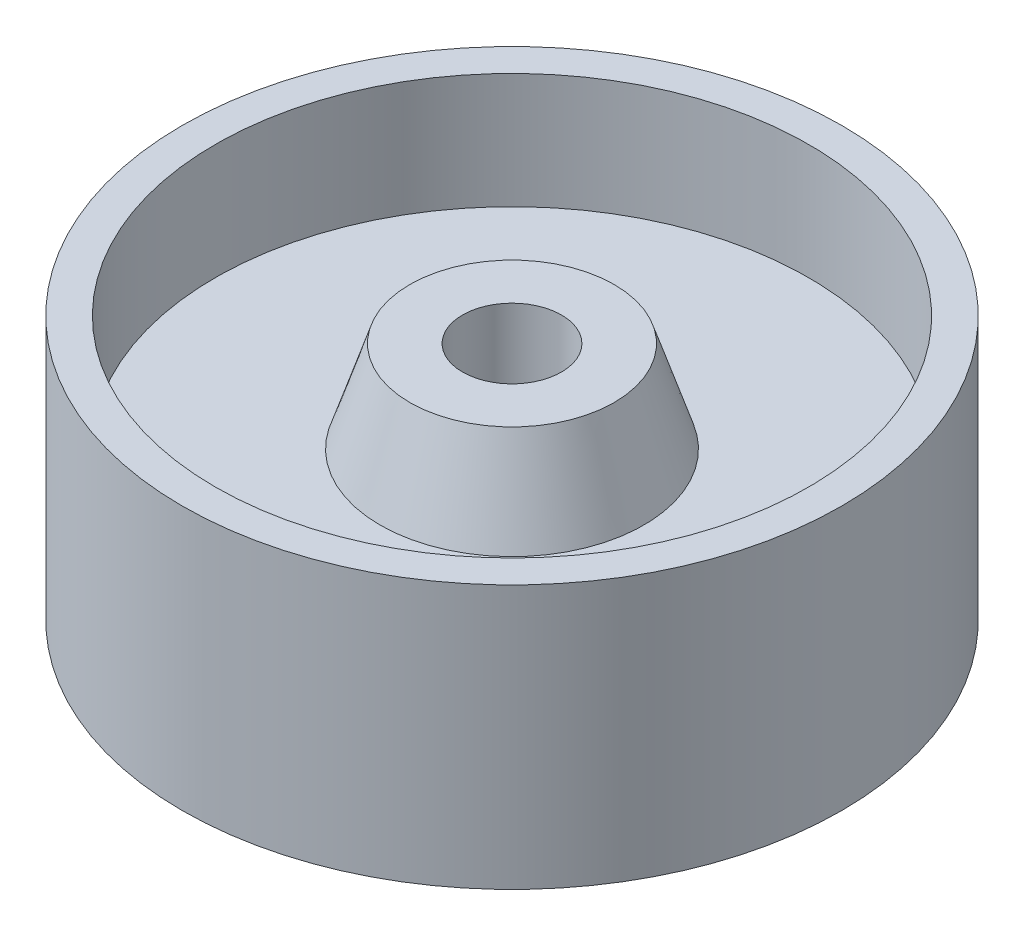
ISO-10303-21;
HEADER;
FILE_DESCRIPTION(('STEP AP214'),'2;1');
FILE_NAME('part.step','',(''),(''),'','','');
FILE_SCHEMA(('AUTOMOTIVE_DESIGN { 1 0 10303 214 1 1 1 1 }'));
ENDSEC;
DATA;
#1=APPLICATION_CONTEXT('core data for automotive mechanical design processes');
#2=APPLICATION_PROTOCOL_DEFINITION('international standard','automotive_design',2000,#1);
#3=PRODUCT_CONTEXT('',#1,'mechanical');
#4=PRODUCT('Part','Part','',(#3));
#5=PRODUCT_RELATED_PRODUCT_CATEGORY('part','',(#4));
#6=PRODUCT_DEFINITION_FORMATION('','',#4);
#7=PRODUCT_DEFINITION_CONTEXT('part definition',#1,'design');
#8=PRODUCT_DEFINITION('design','',#6,#7);
#9=PRODUCT_DEFINITION_SHAPE('','',#8);
#10=(LENGTH_UNIT() NAMED_UNIT(*) SI_UNIT(.MILLI.,.METRE.));
#11=(NAMED_UNIT(*) PLANE_ANGLE_UNIT() SI_UNIT($,.RADIAN.));
#12=(NAMED_UNIT(*) SI_UNIT($,.STERADIAN.) SOLID_ANGLE_UNIT());
#13=UNCERTAINTY_MEASURE_WITH_UNIT(LENGTH_MEASURE(1.E-05),#10,'distance_accuracy_value','');
#14=(GEOMETRIC_REPRESENTATION_CONTEXT(3) GLOBAL_UNCERTAINTY_ASSIGNED_CONTEXT((#13)) GLOBAL_UNIT_ASSIGNED_CONTEXT((#10,
#11,#12)) REPRESENTATION_CONTEXT('',''));
#15=CARTESIAN_POINT('',(0.,0.,0.));
#16=DIRECTION('',(0.,0.,1.));
#17=DIRECTION('',(1.,0.,0.));
#18=AXIS2_PLACEMENT_3D('',#15,#16,#17);
#19=CARTESIAN_POINT('',(0.,1.,2.5));
#20=DIRECTION('',(0.,1.,0.));
#21=DIRECTION('',(0.,0.,1.));
#22=AXIS2_PLACEMENT_3D('',#19,#20,#21);
#23=PLANE('',#22);
#24=CARTESIAN_POINT('',(0.,1.,0.));
#25=DIRECTION('',(0.,1.,0.));
#26=DIRECTION('',(0.,0.,1.));
#27=AXIS2_PLACEMENT_3D('',#24,#25,#26);
#28=CIRCLE('',#27,2.5);
#29=CARTESIAN_POINT('',(0.,1.,2.5));
#30=VERTEX_POINT('',#29);
#31=EDGE_CURVE('E77',#30,#30,#28,.T.);
#32=ORIENTED_EDGE('',*,*,#31,.T.);
#33=EDGE_LOOP('',(#32));
#34=FACE_BOUND('',#33,.T.);
#35=CARTESIAN_POINT('',(0.,1.,0.));
#36=DIRECTION('',(0.,1.,0.));
#37=DIRECTION('',(0.,0.,1.));
#38=AXIS2_PLACEMENT_3D('',#35,#36,#37);
#39=CIRCLE('',#38,2.25);
#40=CARTESIAN_POINT('',(0.,1.,2.25));
#41=VERTEX_POINT('',#40);
#42=EDGE_CURVE('E10',#41,#41,#39,.T.);
#43=ORIENTED_EDGE('',*,*,#42,.F.);
#44=EDGE_LOOP('',(#43));
#45=FACE_BOUND('',#44,.T.);
#46=ADVANCED_FACE('F40',(#34,#45),#23,.T.);
#47=CARTESIAN_POINT('',(0.,2.45357142857143,0.));
#48=DIRECTION('',(0.,1.,0.));
#49=DIRECTION('',(0.,0.,1.));
#50=AXIS2_PLACEMENT_3D('',#47,#48,#49);
#51=CYLINDRICAL_SURFACE('',#50,2.25);
#52=ORIENTED_EDGE('',*,*,#42,.T.);
#53=EDGE_LOOP('',(#52));
#54=FACE_BOUND('',#53,.T.);
#55=CARTESIAN_POINT('',(0.,0.125,0.));
#56=DIRECTION('',(0.,1.,0.));
#57=DIRECTION('',(0.,0.,1.));
#58=AXIS2_PLACEMENT_3D('',#55,#56,#57);
#59=CIRCLE('',#58,2.25);
#60=CARTESIAN_POINT('',(0.,0.125,2.25));
#61=VERTEX_POINT('',#60);
#62=EDGE_CURVE('E43',#61,#61,#59,.T.);
#63=ORIENTED_EDGE('',*,*,#62,.F.);
#64=EDGE_LOOP('',(#63));
#65=FACE_BOUND('',#64,.T.);
#66=ADVANCED_FACE('F94',(#54,#65),#51,.F.);
#67=CARTESIAN_POINT('',(0.,0.125,2.25));
#68=DIRECTION('',(0.,1.,0.));
#69=DIRECTION('',(0.,0.,1.));
#70=AXIS2_PLACEMENT_3D('',#67,#68,#69);
#71=PLANE('',#70);
#72=ORIENTED_EDGE('',*,*,#62,.T.);
#73=EDGE_LOOP('',(#72));
#74=FACE_BOUND('',#73,.T.);
#75=CARTESIAN_POINT('',(0.,0.125,0.));
#76=DIRECTION('',(0.,1.,0.));
#77=DIRECTION('',(0.,0.,1.));
#78=AXIS2_PLACEMENT_3D('',#75,#76,#77);
#79=CIRCLE('',#78,1.);
#80=CARTESIAN_POINT('',(0.,0.125,1.));
#81=VERTEX_POINT('',#80);
#82=EDGE_CURVE('E50',#81,#81,#79,.T.);
#83=ORIENTED_EDGE('',*,*,#82,.F.);
#84=EDGE_LOOP('',(#83));
#85=FACE_BOUND('',#84,.T.);
#86=ADVANCED_FACE('F98',(#74,#85),#71,.T.);
#87=CARTESIAN_POINT('',(0.,0.817478795864445,0.));
#88=DIRECTION('',(0.,-1.,0.));
#89=DIRECTION('',(0.,0.,-1.));
#90=AXIS2_PLACEMENT_3D('',#87,#88,#89);
#91=CONICAL_SURFACE('',#90,0.775,0.314159265358973);
#92=ORIENTED_EDGE('',*,*,#82,.T.);
#93=EDGE_LOOP('',(#92));
#94=FACE_BOUND('',#93,.T.);
#95=CARTESIAN_POINT('',(0.,0.817478795864445,0.));
#96=DIRECTION('',(0.,1.,0.));
#97=DIRECTION('',(0.,0.,1.));
#98=AXIS2_PLACEMENT_3D('',#95,#96,#97);
#99=CIRCLE('',#98,0.775);
#100=CARTESIAN_POINT('',(0.,0.817478795864445,0.775));
#101=VERTEX_POINT('',#100);
#102=EDGE_CURVE('E51',#101,#101,#99,.T.);
#103=ORIENTED_EDGE('',*,*,#102,.F.);
#104=EDGE_LOOP('',(#103));
#105=FACE_BOUND('',#104,.T.);
#106=ADVANCED_FACE('F104',(#94,#105),#91,.T.);
#107=CARTESIAN_POINT('',(0.,0.817478795864445,0.775));
#108=DIRECTION('',(0.,1.,0.));
#109=DIRECTION('',(0.,0.,1.));
#110=AXIS2_PLACEMENT_3D('',#107,#108,#109);
#111=PLANE('',#110);
#112=ORIENTED_EDGE('',*,*,#102,.T.);
#113=EDGE_LOOP('',(#112));
#114=FACE_BOUND('',#113,.T.);
#115=CARTESIAN_POINT('',(0.,0.817478795864445,0.));
#116=DIRECTION('',(0.,1.,0.));
#117=DIRECTION('',(0.,0.,1.));
#118=AXIS2_PLACEMENT_3D('',#115,#116,#117);
#119=CIRCLE('',#118,0.375);
#120=CARTESIAN_POINT('',(0.,0.817478795864445,0.375));
#121=VERTEX_POINT('',#120);
#122=EDGE_CURVE('E57',#121,#121,#119,.T.);
#123=ORIENTED_EDGE('',*,*,#122,.F.);
#124=EDGE_LOOP('',(#123));
#125=FACE_BOUND('',#124,.T.);
#126=ADVANCED_FACE('F108',(#114,#125),#111,.T.);
#127=CARTESIAN_POINT('',(0.,2.45357142857143,0.));
#128=DIRECTION('',(0.,1.,0.));
#129=DIRECTION('',(0.,0.,1.));
#130=AXIS2_PLACEMENT_3D('',#127,#128,#129);
#131=CYLINDRICAL_SURFACE('',#130,0.375);
#132=ORIENTED_EDGE('',*,*,#122,.T.);
#133=EDGE_LOOP('',(#132));
#134=FACE_BOUND('',#133,.T.);
#135=CARTESIAN_POINT('',(0.,-0.817478795864445,0.));
#136=DIRECTION('',(0.,1.,0.));
#137=DIRECTION('',(0.,0.,1.));
#138=AXIS2_PLACEMENT_3D('',#135,#136,#137);
#139=CIRCLE('',#138,0.375);
#140=CARTESIAN_POINT('',(0.,-0.817478795864445,0.375));
#141=VERTEX_POINT('',#140);
#142=EDGE_CURVE('E56',#141,#141,#139,.T.);
#143=ORIENTED_EDGE('',*,*,#142,.F.);
#144=EDGE_LOOP('',(#143));
#145=FACE_BOUND('',#144,.T.);
#146=ADVANCED_FACE('F111',(#134,#145),#131,.F.);
#147=CARTESIAN_POINT('',(0.,-0.817478795864445,0.775));
#148=DIRECTION('',(0.,-1.,0.));
#149=DIRECTION('',(0.,0.,-1.));
#150=AXIS2_PLACEMENT_3D('',#147,#148,#149);
#151=PLANE('',#150);
#152=ORIENTED_EDGE('',*,*,#142,.T.);
#153=EDGE_LOOP('',(#152));
#154=FACE_BOUND('',#153,.T.);
#155=CARTESIAN_POINT('',(0.,-0.817478795864445,0.));
#156=DIRECTION('',(0.,1.,0.));
#157=DIRECTION('',(0.,0.,1.));
#158=AXIS2_PLACEMENT_3D('',#155,#156,#157);
#159=CIRCLE('',#158,0.775);
#160=CARTESIAN_POINT('',(0.,-0.817478795864445,0.775));
#161=VERTEX_POINT('',#160);
#162=EDGE_CURVE('E62',#161,#161,#159,.T.);
#163=ORIENTED_EDGE('',*,*,#162,.F.);
#164=EDGE_LOOP('',(#163));
#165=FACE_BOUND('',#164,.T.);
#166=ADVANCED_FACE('F117',(#154,#165),#151,.T.);
#167=CARTESIAN_POINT('',(0.,-0.125,0.));
#168=DIRECTION('',(0.,1.,0.));
#169=DIRECTION('',(0.,0.,1.));
#170=AXIS2_PLACEMENT_3D('',#167,#168,#169);
#171=CONICAL_SURFACE('',#170,1.,0.314159265358973);
#172=ORIENTED_EDGE('',*,*,#162,.T.);
#173=EDGE_LOOP('',(#172));
#174=FACE_BOUND('',#173,.T.);
#175=CARTESIAN_POINT('',(0.,-0.125,0.));
#176=DIRECTION('',(0.,1.,0.));
#177=DIRECTION('',(0.,0.,1.));
#178=AXIS2_PLACEMENT_3D('',#175,#176,#177);
#179=CIRCLE('',#178,1.);
#180=CARTESIAN_POINT('',(0.,-0.125,1.));
#181=VERTEX_POINT('',#180);
#182=EDGE_CURVE('E65',#181,#181,#179,.T.);
#183=ORIENTED_EDGE('',*,*,#182,.F.);
#184=EDGE_LOOP('',(#183));
#185=FACE_BOUND('',#184,.T.);
#186=ADVANCED_FACE('F123',(#174,#185),#171,.T.);
#187=CARTESIAN_POINT('',(0.,-0.125,2.25));
#188=DIRECTION('',(0.,-1.,0.));
#189=DIRECTION('',(0.,0.,-1.));
#190=AXIS2_PLACEMENT_3D('',#187,#188,#189);
#191=PLANE('',#190);
#192=ORIENTED_EDGE('',*,*,#182,.T.);
#193=EDGE_LOOP('',(#192));
#194=FACE_BOUND('',#193,.T.);
#195=CARTESIAN_POINT('',(0.,-0.125,0.));
#196=DIRECTION('',(0.,1.,0.));
#197=DIRECTION('',(0.,0.,1.));
#198=AXIS2_PLACEMENT_3D('',#195,#196,#197);
#199=CIRCLE('',#198,2.25);
#200=CARTESIAN_POINT('',(0.,-0.125,2.25));
#201=VERTEX_POINT('',#200);
#202=EDGE_CURVE('E66',#201,#201,#199,.T.);
#203=ORIENTED_EDGE('',*,*,#202,.F.);
#204=EDGE_LOOP('',(#203));
#205=FACE_BOUND('',#204,.T.);
#206=ADVANCED_FACE('F124',(#194,#205),#191,.T.);
#207=CARTESIAN_POINT('',(0.,2.45357142857143,0.));
#208=DIRECTION('',(0.,1.,0.));
#209=DIRECTION('',(0.,0.,1.));
#210=AXIS2_PLACEMENT_3D('',#207,#208,#209);
#211=CYLINDRICAL_SURFACE('',#210,2.25);
#212=ORIENTED_EDGE('',*,*,#202,.T.);
#213=EDGE_LOOP('',(#212));
#214=FACE_BOUND('',#213,.T.);
#215=CARTESIAN_POINT('',(0.,-1.,0.));
#216=DIRECTION('',(0.,1.,0.));
#217=DIRECTION('',(0.,0.,1.));
#218=AXIS2_PLACEMENT_3D('',#215,#216,#217);
#219=CIRCLE('',#218,2.25);
#220=CARTESIAN_POINT('',(0.,-1.,2.25));
#221=VERTEX_POINT('',#220);
#222=EDGE_CURVE('E71',#221,#221,#219,.T.);
#223=ORIENTED_EDGE('',*,*,#222,.F.);
#224=EDGE_LOOP('',(#223));
#225=FACE_BOUND('',#224,.T.);
#226=ADVANCED_FACE('F91',(#214,#225),#211,.F.);
#227=CARTESIAN_POINT('',(0.,-1.,2.5));
#228=DIRECTION('',(0.,-1.,0.));
#229=DIRECTION('',(0.,0.,-1.));
#230=AXIS2_PLACEMENT_3D('',#227,#228,#229);
#231=PLANE('',#230);
#232=ORIENTED_EDGE('',*,*,#222,.T.);
#233=EDGE_LOOP('',(#232));
#234=FACE_BOUND('',#233,.T.);
#235=CARTESIAN_POINT('',(0.,-1.,0.));
#236=DIRECTION('',(0.,1.,0.));
#237=DIRECTION('',(0.,0.,1.));
#238=AXIS2_PLACEMENT_3D('',#235,#236,#237);
#239=CIRCLE('',#238,2.5);
#240=CARTESIAN_POINT('',(0.,-1.,2.5));
#241=VERTEX_POINT('',#240);
#242=EDGE_CURVE('E73',#241,#241,#239,.T.);
#243=ORIENTED_EDGE('',*,*,#242,.F.);
#244=EDGE_LOOP('',(#243));
#245=FACE_BOUND('',#244,.T.);
#246=ADVANCED_FACE('F82',(#234,#245),#231,.T.);
#247=CARTESIAN_POINT('',(0.,2.45357142857143,0.));
#248=DIRECTION('',(0.,1.,0.));
#249=DIRECTION('',(0.,0.,1.));
#250=AXIS2_PLACEMENT_3D('',#247,#248,#249);
#251=CYLINDRICAL_SURFACE('',#250,2.5);
#252=ORIENTED_EDGE('',*,*,#242,.T.);
#253=EDGE_LOOP('',(#252));
#254=FACE_BOUND('',#253,.T.);
#255=ORIENTED_EDGE('',*,*,#31,.F.);
#256=EDGE_LOOP('',(#255));
#257=FACE_BOUND('',#256,.T.);
#258=ADVANCED_FACE('F81',(#254,#257),#251,.T.);
#259=CLOSED_SHELL('',(#46,#66,#86,#106,#126,#146,#166,#186,#206,#226,#246,#258));
#260=MANIFOLD_SOLID_BREP('B2',#259);
#261=ADVANCED_BREP_SHAPE_REPRESENTATION('',(#18,#260),#14);
#262=SHAPE_DEFINITION_REPRESENTATION(#9,#261);
ENDSEC;
END-ISO-10303-21;
